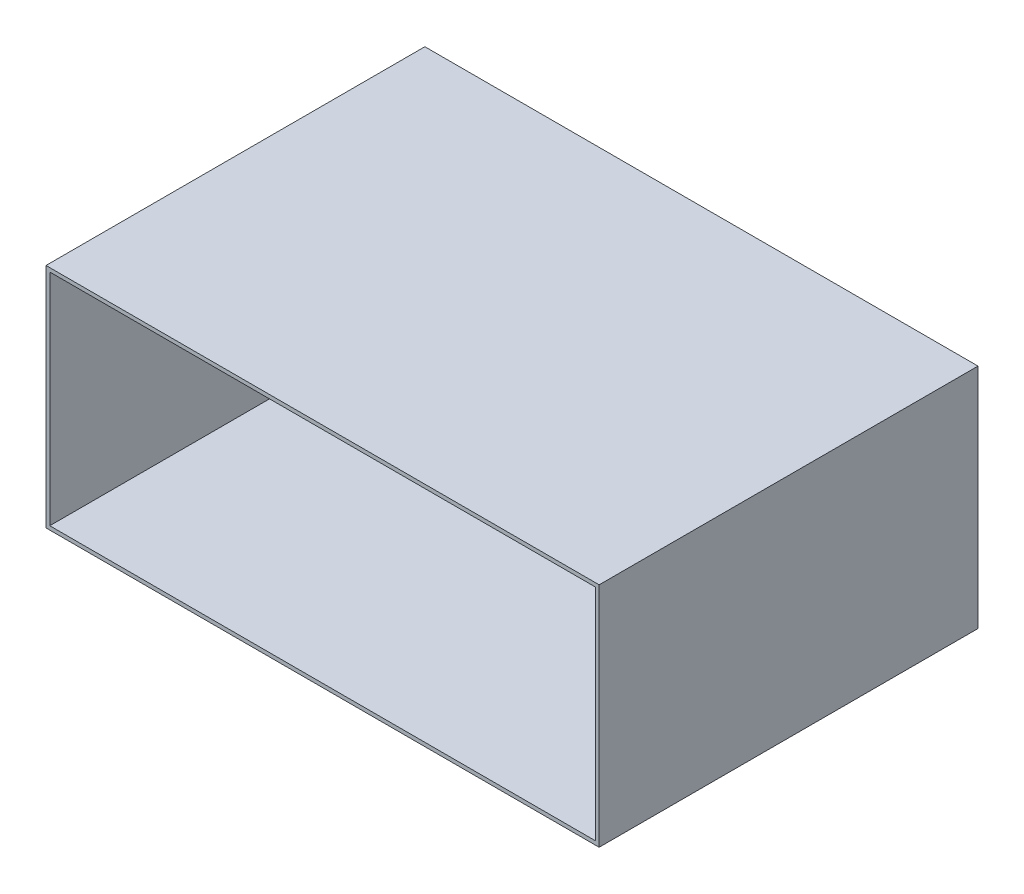
ISO-10303-21;
HEADER;
FILE_DESCRIPTION(('STEP AP214'),'2;1');
FILE_NAME('part.step','',(''),(''),'','','');
FILE_SCHEMA(('AUTOMOTIVE_DESIGN { 1 0 10303 214 1 1 1 1 }'));
ENDSEC;
DATA;
#1=APPLICATION_CONTEXT('core data for automotive mechanical design processes');
#2=APPLICATION_PROTOCOL_DEFINITION('international standard','automotive_design',2000,#1);
#3=PRODUCT_CONTEXT('',#1,'mechanical');
#4=PRODUCT('Part','Part','',(#3));
#5=PRODUCT_RELATED_PRODUCT_CATEGORY('part','',(#4));
#6=PRODUCT_DEFINITION_FORMATION('','',#4);
#7=PRODUCT_DEFINITION_CONTEXT('part definition',#1,'design');
#8=PRODUCT_DEFINITION('design','',#6,#7);
#9=PRODUCT_DEFINITION_SHAPE('','',#8);
#10=(LENGTH_UNIT() NAMED_UNIT(*) SI_UNIT(.MILLI.,.METRE.));
#11=(NAMED_UNIT(*) PLANE_ANGLE_UNIT() SI_UNIT($,.RADIAN.));
#12=(NAMED_UNIT(*) SI_UNIT($,.STERADIAN.) SOLID_ANGLE_UNIT());
#13=UNCERTAINTY_MEASURE_WITH_UNIT(LENGTH_MEASURE(1.E-05),#10,'distance_accuracy_value','');
#14=(GEOMETRIC_REPRESENTATION_CONTEXT(3) GLOBAL_UNCERTAINTY_ASSIGNED_CONTEXT((#13)) GLOBAL_UNIT_ASSIGNED_CONTEXT((#10,
#11,#12)) REPRESENTATION_CONTEXT('',''));
#15=CARTESIAN_POINT('',(0.,0.,0.));
#16=DIRECTION('',(0.,0.,1.));
#17=DIRECTION('',(1.,0.,0.));
#18=AXIS2_PLACEMENT_3D('',#15,#16,#17);
#19=CARTESIAN_POINT('',(0.,0.,50.));
#20=DIRECTION('',(0.,0.,-1.));
#21=DIRECTION('',(-1.,0.,0.));
#22=AXIS2_PLACEMENT_3D('',#19,#20,#21);
#23=PLANE('',#22);
#24=DIRECTION('',(0.,1.,0.));
#25=VECTOR('',#24,1.);
#26=CARTESIAN_POINT('',(-5.7617820180928,63.7330220262505,50.));
#27=LINE('',#26,#25);
#28=CARTESIAN_POINT('',(-5.7617820180928,33.7330220262497,50.));
#29=VERTEX_POINT('',#28);
#30=CARTESIAN_POINT('',(-5.7617820180928,63.7330220262505,50.));
#31=VERTEX_POINT('',#30);
#32=EDGE_CURVE('E134',#29,#31,#27,.T.);
#33=ORIENTED_EDGE('',*,*,#32,.T.);
#34=DIRECTION('',(-1.,0.,0.));
#35=VECTOR('',#34,1.);
#36=CARTESIAN_POINT('',(-78.7617820180928,63.7330220262505,50.));
#37=LINE('',#36,#35);
#38=CARTESIAN_POINT('',(-78.7617820180928,63.7330220262505,50.));
#39=VERTEX_POINT('',#38);
#40=EDGE_CURVE('E137',#31,#39,#37,.T.);
#41=ORIENTED_EDGE('',*,*,#40,.T.);
#42=DIRECTION('',(0.,-1.,0.));
#43=VECTOR('',#42,1.);
#44=CARTESIAN_POINT('',(-78.7617820180928,33.7330220262497,50.));
#45=LINE('',#44,#43);
#46=CARTESIAN_POINT('',(-78.7617820180928,33.7330220262497,50.));
#47=VERTEX_POINT('',#46);
#48=EDGE_CURVE('E140',#39,#47,#45,.T.);
#49=ORIENTED_EDGE('',*,*,#48,.T.);
#50=DIRECTION('',(1.,0.,0.));
#51=VECTOR('',#50,1.);
#52=CARTESIAN_POINT('',(-5.7617820180928,33.7330220262497,50.));
#53=LINE('',#52,#51);
#54=EDGE_CURVE('E142',#47,#29,#53,.T.);
#55=ORIENTED_EDGE('',*,*,#54,.T.);
#56=EDGE_LOOP('',(#33,#41,#49,#55));
#57=FACE_BOUND('',#56,.T.);
#58=DIRECTION('',(0.,1.,0.));
#59=VECTOR('',#58,1.);
#60=CARTESIAN_POINT('',(-6.26178201809281,63.2330220262505,50.));
#61=LINE('',#60,#59);
#62=CARTESIAN_POINT('',(-6.26178201809281,34.2330220262497,50.));
#63=VERTEX_POINT('',#62);
#64=CARTESIAN_POINT('',(-6.26178201809281,63.2330220262505,50.));
#65=VERTEX_POINT('',#64);
#66=EDGE_CURVE('E98',#63,#65,#61,.T.);
#67=ORIENTED_EDGE('',*,*,#66,.F.);
#68=DIRECTION('',(1.,0.,0.));
#69=VECTOR('',#68,1.);
#70=CARTESIAN_POINT('',(-6.26178201809281,34.2330220262497,50.));
#71=LINE('',#70,#69);
#72=CARTESIAN_POINT('',(-78.2617820180928,34.2330220262497,50.));
#73=VERTEX_POINT('',#72);
#74=EDGE_CURVE('E120',#73,#63,#71,.T.);
#75=ORIENTED_EDGE('',*,*,#74,.F.);
#76=DIRECTION('',(0.,-1.,0.));
#77=VECTOR('',#76,1.);
#78=CARTESIAN_POINT('',(-78.2617820180928,34.2330220262497,50.));
#79=LINE('',#78,#77);
#80=CARTESIAN_POINT('',(-78.2617820180928,63.2330220262505,50.));
#81=VERTEX_POINT('',#80);
#82=EDGE_CURVE('E118',#81,#73,#79,.T.);
#83=ORIENTED_EDGE('',*,*,#82,.F.);
#84=DIRECTION('',(-1.,0.,0.));
#85=VECTOR('',#84,1.);
#86=CARTESIAN_POINT('',(-78.2617820180928,63.2330220262505,50.));
#87=LINE('',#86,#85);
#88=EDGE_CURVE('E106',#65,#81,#87,.T.);
#89=ORIENTED_EDGE('',*,*,#88,.F.);
#90=EDGE_LOOP('',(#67,#75,#83,#89));
#91=FACE_BOUND('',#90,.T.);
#92=ADVANCED_FACE('F33',(#57,#91),#23,.F.);
#93=CARTESIAN_POINT('',(0.,0.,0.));
#94=DIRECTION('',(0.,0.,-1.));
#95=DIRECTION('',(-1.,0.,0.));
#96=AXIS2_PLACEMENT_3D('',#93,#94,#95);
#97=PLANE('',#96);
#98=DIRECTION('',(0.,1.,0.));
#99=VECTOR('',#98,1.);
#100=CARTESIAN_POINT('',(-5.7617820180928,63.7330220262505,0.));
#101=LINE('',#100,#99);
#102=CARTESIAN_POINT('',(-5.7617820180928,33.7330220262497,0.));
#103=VERTEX_POINT('',#102);
#104=CARTESIAN_POINT('',(-5.7617820180928,63.7330220262505,0.));
#105=VERTEX_POINT('',#104);
#106=EDGE_CURVE('E114',#103,#105,#101,.T.);
#107=ORIENTED_EDGE('',*,*,#106,.F.);
#108=DIRECTION('',(1.,0.,0.));
#109=VECTOR('',#108,1.);
#110=CARTESIAN_POINT('',(-5.7617820180928,33.7330220262497,0.));
#111=LINE('',#110,#109);
#112=CARTESIAN_POINT('',(-78.7617820180928,33.7330220262497,0.));
#113=VERTEX_POINT('',#112);
#114=EDGE_CURVE('E138',#113,#103,#111,.T.);
#115=ORIENTED_EDGE('',*,*,#114,.F.);
#116=DIRECTION('',(0.,-1.,0.));
#117=VECTOR('',#116,1.);
#118=CARTESIAN_POINT('',(-78.7617820180928,33.7330220262497,0.));
#119=LINE('',#118,#117);
#120=CARTESIAN_POINT('',(-78.7617820180928,63.7330220262505,0.));
#121=VERTEX_POINT('',#120);
#122=EDGE_CURVE('E149',#121,#113,#119,.T.);
#123=ORIENTED_EDGE('',*,*,#122,.F.);
#124=DIRECTION('',(-1.,0.,0.));
#125=VECTOR('',#124,1.);
#126=CARTESIAN_POINT('',(-78.7617820180928,63.7330220262505,0.));
#127=LINE('',#126,#125);
#128=EDGE_CURVE('E147',#105,#121,#127,.T.);
#129=ORIENTED_EDGE('',*,*,#128,.F.);
#130=EDGE_LOOP('',(#107,#115,#123,#129));
#131=FACE_BOUND('',#130,.T.);
#132=DIRECTION('',(1.,0.,0.));
#133=VECTOR('',#132,1.);
#134=CARTESIAN_POINT('',(-6.26178201809281,34.2330220262497,0.));
#135=LINE('',#134,#133);
#136=CARTESIAN_POINT('',(-78.2617820180928,34.2330220262497,0.));
#137=VERTEX_POINT('',#136);
#138=CARTESIAN_POINT('',(-6.26178201809281,34.2330220262497,0.));
#139=VERTEX_POINT('',#138);
#140=EDGE_CURVE('E107',#137,#139,#135,.T.);
#141=ORIENTED_EDGE('',*,*,#140,.T.);
#142=DIRECTION('',(0.,1.,0.));
#143=VECTOR('',#142,1.);
#144=CARTESIAN_POINT('',(-6.26178201809281,63.2330220262505,0.));
#145=LINE('',#144,#143);
#146=CARTESIAN_POINT('',(-6.26178201809281,63.2330220262505,0.));
#147=VERTEX_POINT('',#146);
#148=EDGE_CURVE('E56',#139,#147,#145,.T.);
#149=ORIENTED_EDGE('',*,*,#148,.T.);
#150=DIRECTION('',(-1.,0.,0.));
#151=VECTOR('',#150,1.);
#152=CARTESIAN_POINT('',(-78.2617820180928,63.2330220262505,0.));
#153=LINE('',#152,#151);
#154=CARTESIAN_POINT('',(-78.2617820180928,63.2330220262505,0.));
#155=VERTEX_POINT('',#154);
#156=EDGE_CURVE('E113',#147,#155,#153,.T.);
#157=ORIENTED_EDGE('',*,*,#156,.T.);
#158=DIRECTION('',(0.,-1.,0.));
#159=VECTOR('',#158,1.);
#160=CARTESIAN_POINT('',(-78.2617820180928,34.2330220262497,0.));
#161=LINE('',#160,#159);
#162=EDGE_CURVE('E126',#155,#137,#161,.T.);
#163=ORIENTED_EDGE('',*,*,#162,.T.);
#164=EDGE_LOOP('',(#141,#149,#157,#163));
#165=FACE_BOUND('',#164,.T.);
#166=ADVANCED_FACE('F167',(#131,#165),#97,.T.);
#167=CARTESIAN_POINT('',(-5.7617820180928,63.7330220262505,50.));
#168=DIRECTION('',(-1.,0.,0.));
#169=DIRECTION('',(0.,0.,1.));
#170=AXIS2_PLACEMENT_3D('',#167,#168,#169);
#171=PLANE('',#170);
#172=ORIENTED_EDGE('',*,*,#106,.T.);
#173=DIRECTION('',(0.,0.,-1.));
#174=VECTOR('',#173,1.);
#175=CARTESIAN_POINT('',(-5.7617820180928,63.7330220262505,50.));
#176=LINE('',#175,#174);
#177=EDGE_CURVE('E11',#31,#105,#176,.T.);
#178=ORIENTED_EDGE('',*,*,#177,.F.);
#179=ORIENTED_EDGE('',*,*,#32,.F.);
#180=DIRECTION('',(0.,0.,-1.));
#181=VECTOR('',#180,1.);
#182=CARTESIAN_POINT('',(-5.7617820180928,33.7330220262497,50.));
#183=LINE('',#182,#181);
#184=EDGE_CURVE('E144',#29,#103,#183,.T.);
#185=ORIENTED_EDGE('',*,*,#184,.T.);
#186=EDGE_LOOP('',(#172,#178,#179,#185));
#187=FACE_BOUND('',#186,.T.);
#188=ADVANCED_FACE('F35',(#187),#171,.F.);
#189=CARTESIAN_POINT('',(-78.7617820180928,63.7330220262505,50.));
#190=DIRECTION('',(0.,-1.,0.));
#191=DIRECTION('',(0.,0.,-1.));
#192=AXIS2_PLACEMENT_3D('',#189,#190,#191);
#193=PLANE('',#192);
#194=ORIENTED_EDGE('',*,*,#128,.T.);
#195=DIRECTION('',(0.,0.,-1.));
#196=VECTOR('',#195,1.);
#197=CARTESIAN_POINT('',(-78.7617820180928,63.7330220262505,50.));
#198=LINE('',#197,#196);
#199=EDGE_CURVE('E41',#39,#121,#198,.T.);
#200=ORIENTED_EDGE('',*,*,#199,.F.);
#201=ORIENTED_EDGE('',*,*,#40,.F.);
#202=ORIENTED_EDGE('',*,*,#177,.T.);
#203=EDGE_LOOP('',(#194,#200,#201,#202));
#204=FACE_BOUND('',#203,.T.);
#205=ADVANCED_FACE('F177',(#204),#193,.F.);
#206=CARTESIAN_POINT('',(-78.7617820180928,33.7330220262497,50.));
#207=DIRECTION('',(1.,0.,0.));
#208=DIRECTION('',(0.,0.,-1.));
#209=AXIS2_PLACEMENT_3D('',#206,#207,#208);
#210=PLANE('',#209);
#211=ORIENTED_EDGE('',*,*,#122,.T.);
#212=DIRECTION('',(0.,0.,-1.));
#213=VECTOR('',#212,1.);
#214=CARTESIAN_POINT('',(-78.7617820180928,33.7330220262497,50.));
#215=LINE('',#214,#213);
#216=EDGE_CURVE('E154',#47,#113,#215,.T.);
#217=ORIENTED_EDGE('',*,*,#216,.F.);
#218=ORIENTED_EDGE('',*,*,#48,.F.);
#219=ORIENTED_EDGE('',*,*,#199,.T.);
#220=EDGE_LOOP('',(#211,#217,#218,#219));
#221=FACE_BOUND('',#220,.T.);
#222=ADVANCED_FACE('F161',(#221),#210,.F.);
#223=CARTESIAN_POINT('',(-5.7617820180928,33.7330220262497,50.));
#224=DIRECTION('',(0.,1.,0.));
#225=DIRECTION('',(0.,0.,1.));
#226=AXIS2_PLACEMENT_3D('',#223,#224,#225);
#227=PLANE('',#226);
#228=ORIENTED_EDGE('',*,*,#114,.T.);
#229=ORIENTED_EDGE('',*,*,#184,.F.);
#230=ORIENTED_EDGE('',*,*,#54,.F.);
#231=ORIENTED_EDGE('',*,*,#216,.T.);
#232=EDGE_LOOP('',(#228,#229,#230,#231));
#233=FACE_BOUND('',#232,.T.);
#234=ADVANCED_FACE('F171',(#233),#227,.F.);
#235=CARTESIAN_POINT('',(-6.26178201809281,63.2330220262505,50.));
#236=DIRECTION('',(-1.,0.,0.));
#237=DIRECTION('',(0.,0.,1.));
#238=AXIS2_PLACEMENT_3D('',#235,#236,#237);
#239=PLANE('',#238);
#240=ORIENTED_EDGE('',*,*,#148,.F.);
#241=DIRECTION('',(0.,0.,-1.));
#242=VECTOR('',#241,1.);
#243=CARTESIAN_POINT('',(-6.26178201809281,34.2330220262497,50.));
#244=LINE('',#243,#242);
#245=EDGE_CURVE('E102',#63,#139,#244,.T.);
#246=ORIENTED_EDGE('',*,*,#245,.F.);
#247=ORIENTED_EDGE('',*,*,#66,.T.);
#248=DIRECTION('',(0.,0.,-1.));
#249=VECTOR('',#248,1.);
#250=CARTESIAN_POINT('',(-6.26178201809281,63.2330220262505,50.));
#251=LINE('',#250,#249);
#252=EDGE_CURVE('E101',#65,#147,#251,.T.);
#253=ORIENTED_EDGE('',*,*,#252,.T.);
#254=EDGE_LOOP('',(#240,#246,#247,#253));
#255=FACE_BOUND('',#254,.T.);
#256=ADVANCED_FACE('F100',(#255),#239,.T.);
#257=CARTESIAN_POINT('',(-78.2617820180928,63.2330220262505,50.));
#258=DIRECTION('',(0.,-1.,0.));
#259=DIRECTION('',(0.,0.,-1.));
#260=AXIS2_PLACEMENT_3D('',#257,#258,#259);
#261=PLANE('',#260);
#262=ORIENTED_EDGE('',*,*,#156,.F.);
#263=ORIENTED_EDGE('',*,*,#252,.F.);
#264=ORIENTED_EDGE('',*,*,#88,.T.);
#265=DIRECTION('',(0.,0.,-1.));
#266=VECTOR('',#265,1.);
#267=CARTESIAN_POINT('',(-78.2617820180928,63.2330220262505,50.));
#268=LINE('',#267,#266);
#269=EDGE_CURVE('E115',#81,#155,#268,.T.);
#270=ORIENTED_EDGE('',*,*,#269,.T.);
#271=EDGE_LOOP('',(#262,#263,#264,#270));
#272=FACE_BOUND('',#271,.T.);
#273=ADVANCED_FACE('F110',(#272),#261,.T.);
#274=CARTESIAN_POINT('',(-78.2617820180928,34.2330220262497,50.));
#275=DIRECTION('',(1.,0.,0.));
#276=DIRECTION('',(0.,0.,-1.));
#277=AXIS2_PLACEMENT_3D('',#274,#275,#276);
#278=PLANE('',#277);
#279=ORIENTED_EDGE('',*,*,#162,.F.);
#280=ORIENTED_EDGE('',*,*,#269,.F.);
#281=ORIENTED_EDGE('',*,*,#82,.T.);
#282=DIRECTION('',(0.,0.,-1.));
#283=VECTOR('',#282,1.);
#284=CARTESIAN_POINT('',(-78.2617820180928,34.2330220262497,50.));
#285=LINE('',#284,#283);
#286=EDGE_CURVE('E48',#73,#137,#285,.T.);
#287=ORIENTED_EDGE('',*,*,#286,.T.);
#288=EDGE_LOOP('',(#279,#280,#281,#287));
#289=FACE_BOUND('',#288,.T.);
#290=ADVANCED_FACE('F200',(#289),#278,.T.);
#291=CARTESIAN_POINT('',(-6.26178201809281,34.2330220262497,50.));
#292=DIRECTION('',(0.,1.,0.));
#293=DIRECTION('',(0.,0.,1.));
#294=AXIS2_PLACEMENT_3D('',#291,#292,#293);
#295=PLANE('',#294);
#296=ORIENTED_EDGE('',*,*,#140,.F.);
#297=ORIENTED_EDGE('',*,*,#286,.F.);
#298=ORIENTED_EDGE('',*,*,#74,.T.);
#299=ORIENTED_EDGE('',*,*,#245,.T.);
#300=EDGE_LOOP('',(#296,#297,#298,#299));
#301=FACE_BOUND('',#300,.T.);
#302=ADVANCED_FACE('F204',(#301),#295,.T.);
#303=CLOSED_SHELL('',(#92,#166,#188,#205,#222,#234,#256,#273,#290,#302));
#304=MANIFOLD_SOLID_BREP('B2',#303);
#305=ADVANCED_BREP_SHAPE_REPRESENTATION('',(#18,#304),#14);
#306=SHAPE_DEFINITION_REPRESENTATION(#9,#305);
ENDSEC;
END-ISO-10303-21;
